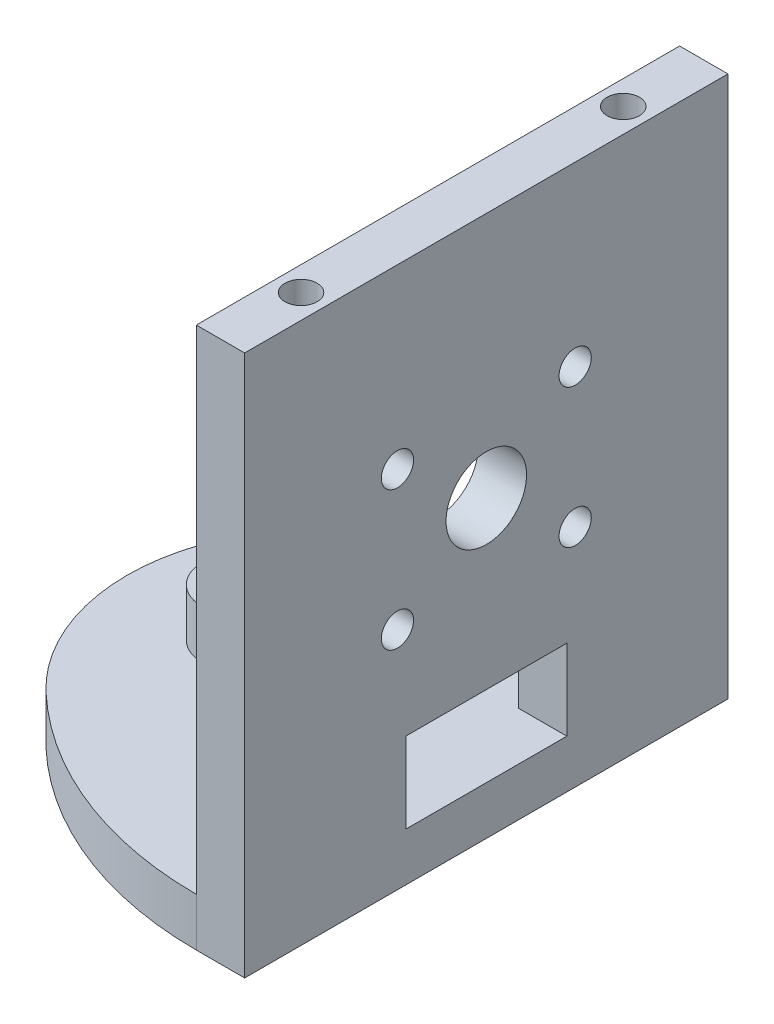
ISO-10303-21;
HEADER;
FILE_DESCRIPTION(('STEP AP214'),'2;1');
FILE_NAME('part.step','',(''),(''),'','','');
FILE_SCHEMA(('AUTOMOTIVE_DESIGN { 1 0 10303 214 1 1 1 1 }'));
ENDSEC;
DATA;
#1=APPLICATION_CONTEXT('core data for automotive mechanical design processes');
#2=APPLICATION_PROTOCOL_DEFINITION('international standard','automotive_design',2000,#1);
#3=PRODUCT_CONTEXT('',#1,'mechanical');
#4=PRODUCT('Part','Part','',(#3));
#5=PRODUCT_RELATED_PRODUCT_CATEGORY('part','',(#4));
#6=PRODUCT_DEFINITION_FORMATION('','',#4);
#7=PRODUCT_DEFINITION_CONTEXT('part definition',#1,'design');
#8=PRODUCT_DEFINITION('design','',#6,#7);
#9=PRODUCT_DEFINITION_SHAPE('','',#8);
#10=(LENGTH_UNIT() NAMED_UNIT(*) SI_UNIT(.MILLI.,.METRE.));
#11=(NAMED_UNIT(*) PLANE_ANGLE_UNIT() SI_UNIT($,.RADIAN.));
#12=(NAMED_UNIT(*) SI_UNIT($,.STERADIAN.) SOLID_ANGLE_UNIT());
#13=UNCERTAINTY_MEASURE_WITH_UNIT(LENGTH_MEASURE(1.E-05),#10,'distance_accuracy_value','');
#14=(GEOMETRIC_REPRESENTATION_CONTEXT(3) GLOBAL_UNCERTAINTY_ASSIGNED_CONTEXT((#13)) GLOBAL_UNIT_ASSIGNED_CONTEXT((#10,
#11,#12)) REPRESENTATION_CONTEXT('',''));
#15=CARTESIAN_POINT('',(0.,0.,0.));
#16=DIRECTION('',(0.,0.,1.));
#17=DIRECTION('',(1.,0.,0.));
#18=AXIS2_PLACEMENT_3D('',#15,#16,#17);
#19=CARTESIAN_POINT('',(0.,0.,0.));
#20=DIRECTION('',(0.,1.,0.));
#21=DIRECTION('',(0.,0.,1.));
#22=AXIS2_PLACEMENT_3D('',#19,#20,#21);
#23=PLANE('',#22);
#24=DIRECTION('',(0.,0.,1.));
#25=VECTOR('',#24,1.);
#26=CARTESIAN_POINT('',(12.3,0.,-15.));
#27=LINE('',#26,#25);
#28=CARTESIAN_POINT('',(12.3,0.,-15.));
#29=VERTEX_POINT('',#28);
#30=CARTESIAN_POINT('',(12.3,0.,-5.));
#31=VERTEX_POINT('',#30);
#32=EDGE_CURVE('E197',#29,#31,#27,.T.);
#33=ORIENTED_EDGE('',*,*,#32,.F.);
#34=CARTESIAN_POINT('',(12.3,0.,7.54962402661894));
#35=DIRECTION('',(0.,1.,0.));
#36=DIRECTION('',(0.,0.,1.));
#37=AXIS2_PLACEMENT_3D('',#34,#35,#36);
#38=CIRCLE('',#37,22.5496240266189);
#39=CARTESIAN_POINT('',(-3.2,0.,-8.8282739991312));
#40=VERTEX_POINT('',#39);
#41=EDGE_CURVE('E211',#29,#40,#38,.T.);
#42=ORIENTED_EDGE('',*,*,#41,.T.);
#43=CARTESIAN_POINT('',(5.15505550049156,0.,0.));
#44=DIRECTION('',(0.,1.,0.));
#45=DIRECTION('',(0.,0.,1.));
#46=AXIS2_PLACEMENT_3D('',#43,#44,#45);
#47=CIRCLE('',#46,12.1550555004916);
#48=CARTESIAN_POINT('',(-3.2,0.,8.8282739991312));
#49=VERTEX_POINT('',#48);
#50=EDGE_CURVE('E231',#40,#49,#47,.T.);
#51=ORIENTED_EDGE('',*,*,#50,.T.);
#52=CARTESIAN_POINT('',(12.3,0.,-7.54962402661894));
#53=DIRECTION('',(0.,1.,0.));
#54=DIRECTION('',(0.,0.,1.));
#55=AXIS2_PLACEMENT_3D('',#52,#53,#54);
#56=CIRCLE('',#55,22.5496240266189);
#57=CARTESIAN_POINT('',(12.3,0.,15.));
#58=VERTEX_POINT('',#57);
#59=EDGE_CURVE('E216',#58,#49,#56,.F.);
#60=ORIENTED_EDGE('',*,*,#59,.F.);
#61=CARTESIAN_POINT('',(12.3,0.,5.));
#62=VERTEX_POINT('',#61);
#63=EDGE_CURVE('E190',#62,#58,#27,.T.);
#64=ORIENTED_EDGE('',*,*,#63,.F.);
#65=DIRECTION('',(-1.,0.,0.));
#66=VECTOR('',#65,1.);
#67=CARTESIAN_POINT('',(15.3,0.,5.));
#68=LINE('',#67,#66);
#69=CARTESIAN_POINT('',(15.3,0.,5.));
#70=VERTEX_POINT('',#69);
#71=EDGE_CURVE('E125',#70,#62,#68,.T.);
#72=ORIENTED_EDGE('',*,*,#71,.F.);
#73=DIRECTION('',(0.,0.,1.));
#74=VECTOR('',#73,1.);
#75=CARTESIAN_POINT('',(15.3,0.,-5.));
#76=LINE('',#75,#74);
#77=CARTESIAN_POINT('',(15.3,0.,-5.));
#78=VERTEX_POINT('',#77);
#79=EDGE_CURVE('E129',#78,#70,#76,.T.);
#80=ORIENTED_EDGE('',*,*,#79,.F.);
#81=DIRECTION('',(-1.,0.,0.));
#82=VECTOR('',#81,1.);
#83=CARTESIAN_POINT('',(15.3,0.,-5.));
#84=LINE('',#83,#82);
#85=EDGE_CURVE('E117',#78,#31,#84,.T.);
#86=ORIENTED_EDGE('',*,*,#85,.T.);
#87=EDGE_LOOP('',(#33,#42,#51,#60,#64,#72,#80,#86));
#88=FACE_BOUND('',#87,.T.);
#89=CARTESIAN_POINT('',(0.,0.,0.));
#90=DIRECTION('',(0.,1.,0.));
#91=DIRECTION('',(0.,0.,1.));
#92=AXIS2_PLACEMENT_3D('',#89,#90,#91);
#93=CIRCLE('',#92,2.35);
#94=CARTESIAN_POINT('',(0.,0.,2.35));
#95=VERTEX_POINT('',#94);
#96=EDGE_CURVE('E171',#95,#95,#93,.T.);
#97=ORIENTED_EDGE('',*,*,#96,.F.);
#98=EDGE_LOOP('',(#97));
#99=FACE_BOUND('',#98,.T.);
#100=ADVANCED_FACE('F34',(#88,#99),#23,.T.);
#101=CARTESIAN_POINT('',(12.3,-3.,7.54962402661894));
#102=DIRECTION('',(0.,1.,0.));
#103=DIRECTION('',(0.,0.,1.));
#104=AXIS2_PLACEMENT_3D('',#101,#102,#103);
#105=CYLINDRICAL_SURFACE('',#104,22.5496240266189);
#106=ORIENTED_EDGE('',*,*,#41,.F.);
#107=DIRECTION('',(0.,1.,0.));
#108=VECTOR('',#107,1.);
#109=CARTESIAN_POINT('',(12.3,-3.,-15.));
#110=LINE('',#109,#108);
#111=CARTESIAN_POINT('',(12.3,-3.,-15.));
#112=VERTEX_POINT('',#111);
#113=EDGE_CURVE('E11',#112,#29,#110,.T.);
#114=ORIENTED_EDGE('',*,*,#113,.F.);
#115=CARTESIAN_POINT('',(12.3,-3.,7.54962402661894));
#116=DIRECTION('',(0.,1.,0.));
#117=DIRECTION('',(0.,0.,1.));
#118=AXIS2_PLACEMENT_3D('',#115,#116,#117);
#119=CIRCLE('',#118,22.5496240266189);
#120=CARTESIAN_POINT('',(-3.2,-3.,-8.8282739991312));
#121=VERTEX_POINT('',#120);
#122=EDGE_CURVE('E212',#112,#121,#119,.T.);
#123=ORIENTED_EDGE('',*,*,#122,.T.);
#124=DIRECTION('',(0.,1.,0.));
#125=VECTOR('',#124,1.);
#126=CARTESIAN_POINT('',(-3.2,-3.,-8.8282739991312));
#127=LINE('',#126,#125);
#128=EDGE_CURVE('E228',#121,#40,#127,.T.);
#129=ORIENTED_EDGE('',*,*,#128,.T.);
#130=EDGE_LOOP('',(#106,#114,#123,#129));
#131=FACE_BOUND('',#130,.T.);
#132=ADVANCED_FACE('F36',(#131),#105,.T.);
#133=CARTESIAN_POINT('',(0.,-3.,-15.));
#134=DIRECTION('',(0.,0.,1.));
#135=DIRECTION('',(1.,0.,0.));
#136=AXIS2_PLACEMENT_3D('',#133,#134,#135);
#137=PLANE('',#136);
#138=ORIENTED_EDGE('',*,*,#113,.T.);
#139=DIRECTION('',(0.,-1.,0.));
#140=VECTOR('',#139,1.);
#141=CARTESIAN_POINT('',(12.3,30.6,-15.));
#142=LINE('',#141,#140);
#143=CARTESIAN_POINT('',(12.3,30.6,-15.));
#144=VERTEX_POINT('',#143);
#145=EDGE_CURVE('E208',#144,#29,#142,.T.);
#146=ORIENTED_EDGE('',*,*,#145,.F.);
#147=DIRECTION('',(-1.,0.,0.));
#148=VECTOR('',#147,1.);
#149=CARTESIAN_POINT('',(15.3,30.6,-15.));
#150=LINE('',#149,#148);
#151=CARTESIAN_POINT('',(15.3,30.6,-15.));
#152=VERTEX_POINT('',#151);
#153=EDGE_CURVE('E196',#152,#144,#150,.T.);
#154=ORIENTED_EDGE('',*,*,#153,.F.);
#155=DIRECTION('',(0.,1.,0.));
#156=VECTOR('',#155,1.);
#157=CARTESIAN_POINT('',(15.3,-3.,-15.));
#158=LINE('',#157,#156);
#159=CARTESIAN_POINT('',(15.3,-3.,-15.));
#160=VERTEX_POINT('',#159);
#161=EDGE_CURVE('E43',#160,#152,#158,.T.);
#162=ORIENTED_EDGE('',*,*,#161,.F.);
#163=DIRECTION('',(1.,0.,0.));
#164=VECTOR('',#163,1.);
#165=CARTESIAN_POINT('',(0.,-3.,-15.));
#166=LINE('',#165,#164);
#167=EDGE_CURVE('E226',#112,#160,#166,.T.);
#168=ORIENTED_EDGE('',*,*,#167,.F.);
#169=EDGE_LOOP('',(#138,#146,#154,#162,#168));
#170=FACE_BOUND('',#169,.T.);
#171=ADVANCED_FACE('F275',(#170),#137,.F.);
#172=CARTESIAN_POINT('',(15.3,-3.,0.));
#173=DIRECTION('',(-1.,0.,0.));
#174=DIRECTION('',(0.,0.,1.));
#175=AXIS2_PLACEMENT_3D('',#172,#173,#174);
#176=PLANE('',#175);
#177=DIRECTION('',(0.,0.,-1.));
#178=VECTOR('',#177,1.);
#179=CARTESIAN_POINT('',(15.3,5.,-5.));
#180=LINE('',#179,#178);
#181=CARTESIAN_POINT('',(15.3,5.,5.));
#182=VERTEX_POINT('',#181);
#183=CARTESIAN_POINT('',(15.3,5.,-5.));
#184=VERTEX_POINT('',#183);
#185=EDGE_CURVE('E126',#182,#184,#180,.T.);
#186=ORIENTED_EDGE('',*,*,#185,.T.);
#187=DIRECTION('',(0.,-1.,0.));
#188=VECTOR('',#187,1.);
#189=CARTESIAN_POINT('',(15.3,0.,-5.));
#190=LINE('',#189,#188);
#191=EDGE_CURVE('E121',#184,#78,#190,.T.);
#192=ORIENTED_EDGE('',*,*,#191,.T.);
#193=ORIENTED_EDGE('',*,*,#79,.T.);
#194=DIRECTION('',(0.,1.,0.));
#195=VECTOR('',#194,1.);
#196=CARTESIAN_POINT('',(15.3,0.,5.));
#197=LINE('',#196,#195);
#198=EDGE_CURVE('E51',#70,#182,#197,.T.);
#199=ORIENTED_EDGE('',*,*,#198,.T.);
#200=EDGE_LOOP('',(#186,#192,#193,#199));
#201=FACE_BOUND('',#200,.T.);
#202=CARTESIAN_POINT('',(15.3,10.9909182971804,5.51650386371886));
#203=DIRECTION('',(1.,0.,0.));
#204=DIRECTION('',(0.,0.,-1.));
#205=AXIS2_PLACEMENT_3D('',#202,#203,#204);
#206=CIRCLE('',#205,0.999999999999998);
#207=CARTESIAN_POINT('',(15.3,10.9909182971804,4.51650386371887));
#208=VERTEX_POINT('',#207);
#209=EDGE_CURVE('E150',#208,#208,#206,.T.);
#210=ORIENTED_EDGE('',*,*,#209,.F.);
#211=EDGE_LOOP('',(#210));
#212=FACE_BOUND('',#211,.T.);
#213=CARTESIAN_POINT('',(15.3,19.6101789091115,5.51564663221372));
#214=DIRECTION('',(1.,0.,0.));
#215=DIRECTION('',(0.,0.,-1.));
#216=AXIS2_PLACEMENT_3D('',#213,#214,#215);
#217=CIRCLE('',#216,1.);
#218=CARTESIAN_POINT('',(15.3,19.6101789091115,4.51564663221372));
#219=VERTEX_POINT('',#218);
#220=EDGE_CURVE('E156',#219,#219,#217,.T.);
#221=ORIENTED_EDGE('',*,*,#220,.F.);
#222=EDGE_LOOP('',(#221));
#223=FACE_BOUND('',#222,.T.);
#224=CARTESIAN_POINT('',(15.3,10.9898210908885,-5.51564663221372));
#225=DIRECTION('',(1.,0.,0.));
#226=DIRECTION('',(0.,0.,-1.));
#227=AXIS2_PLACEMENT_3D('',#224,#225,#226);
#228=CIRCLE('',#227,0.999999999999998);
#229=CARTESIAN_POINT('',(15.3,10.9898210908885,-6.51564663221372));
#230=VERTEX_POINT('',#229);
#231=EDGE_CURVE('E160',#230,#230,#228,.T.);
#232=ORIENTED_EDGE('',*,*,#231,.F.);
#233=EDGE_LOOP('',(#232));
#234=FACE_BOUND('',#233,.T.);
#235=CARTESIAN_POINT('',(15.3,19.6090817028196,-5.51650386371886));
#236=DIRECTION('',(1.,0.,0.));
#237=DIRECTION('',(0.,0.,-1.));
#238=AXIS2_PLACEMENT_3D('',#235,#236,#237);
#239=CIRCLE('',#238,1.);
#240=CARTESIAN_POINT('',(15.3,19.6090817028196,-6.51650386371886));
#241=VERTEX_POINT('',#240);
#242=EDGE_CURVE('E164',#241,#241,#239,.T.);
#243=ORIENTED_EDGE('',*,*,#242,.F.);
#244=EDGE_LOOP('',(#243));
#245=FACE_BOUND('',#244,.T.);
#246=CARTESIAN_POINT('',(15.3,15.3,0.));
#247=DIRECTION('',(-1.,0.,0.));
#248=DIRECTION('',(0.,0.,1.));
#249=AXIS2_PLACEMENT_3D('',#246,#247,#248);
#250=CIRCLE('',#249,2.5);
#251=CARTESIAN_POINT('',(15.3,15.3,2.5));
#252=VERTEX_POINT('',#251);
#253=EDGE_CURVE('E168',#252,#252,#250,.T.);
#254=ORIENTED_EDGE('',*,*,#253,.T.);
#255=EDGE_LOOP('',(#254));
#256=FACE_BOUND('',#255,.T.);
#257=ORIENTED_EDGE('',*,*,#161,.T.);
#258=DIRECTION('',(0.,0.,-1.));
#259=VECTOR('',#258,1.);
#260=CARTESIAN_POINT('',(15.3,30.6,-15.));
#261=LINE('',#260,#259);
#262=CARTESIAN_POINT('',(15.3,30.6,15.));
#263=VERTEX_POINT('',#262);
#264=EDGE_CURVE('E193',#263,#152,#261,.T.);
#265=ORIENTED_EDGE('',*,*,#264,.F.);
#266=DIRECTION('',(0.,1.,0.));
#267=VECTOR('',#266,1.);
#268=CARTESIAN_POINT('',(15.3,-3.,15.));
#269=LINE('',#268,#267);
#270=CARTESIAN_POINT('',(15.3,-3.,15.));
#271=VERTEX_POINT('',#270);
#272=EDGE_CURVE('E237',#271,#263,#269,.T.);
#273=ORIENTED_EDGE('',*,*,#272,.F.);
#274=DIRECTION('',(0.,0.,1.));
#275=VECTOR('',#274,1.);
#276=CARTESIAN_POINT('',(15.3,-3.,0.));
#277=LINE('',#276,#275);
#278=EDGE_CURVE('E224',#160,#271,#277,.T.);
#279=ORIENTED_EDGE('',*,*,#278,.F.);
#280=EDGE_LOOP('',(#257,#265,#273,#279));
#281=FACE_BOUND('',#280,.T.);
#282=ADVANCED_FACE('F134',(#201,#212,#223,#234,#245,#256,#281),#176,.F.);
#283=CARTESIAN_POINT('',(0.,-3.,15.));
#284=DIRECTION('',(0.,0.,1.));
#285=DIRECTION('',(1.,0.,0.));
#286=AXIS2_PLACEMENT_3D('',#283,#284,#285);
#287=PLANE('',#286);
#288=ORIENTED_EDGE('',*,*,#272,.T.);
#289=DIRECTION('',(1.,0.,0.));
#290=VECTOR('',#289,1.);
#291=CARTESIAN_POINT('',(15.3,30.6,15.));
#292=LINE('',#291,#290);
#293=CARTESIAN_POINT('',(12.3,30.6,15.));
#294=VERTEX_POINT('',#293);
#295=EDGE_CURVE('E201',#294,#263,#292,.T.);
#296=ORIENTED_EDGE('',*,*,#295,.F.);
#297=DIRECTION('',(0.,-1.,0.));
#298=VECTOR('',#297,1.);
#299=CARTESIAN_POINT('',(12.3,30.6,15.));
#300=LINE('',#299,#298);
#301=EDGE_CURVE('E204',#294,#58,#300,.T.);
#302=ORIENTED_EDGE('',*,*,#301,.T.);
#303=DIRECTION('',(0.,1.,0.));
#304=VECTOR('',#303,1.);
#305=CARTESIAN_POINT('',(12.3,-3.,15.));
#306=LINE('',#305,#304);
#307=CARTESIAN_POINT('',(12.3,-3.,15.));
#308=VERTEX_POINT('',#307);
#309=EDGE_CURVE('E239',#308,#58,#306,.T.);
#310=ORIENTED_EDGE('',*,*,#309,.F.);
#311=DIRECTION('',(1.,0.,0.));
#312=VECTOR('',#311,1.);
#313=CARTESIAN_POINT('',(0.,-3.,15.));
#314=LINE('',#313,#312);
#315=EDGE_CURVE('E221',#308,#271,#314,.T.);
#316=ORIENTED_EDGE('',*,*,#315,.T.);
#317=EDGE_LOOP('',(#288,#296,#302,#310,#316));
#318=FACE_BOUND('',#317,.T.);
#319=ADVANCED_FACE('F286',(#318),#287,.T.);
#320=CARTESIAN_POINT('',(12.3,-3.,-7.54962402661894));
#321=DIRECTION('',(0.,1.,0.));
#322=DIRECTION('',(0.,0.,1.));
#323=AXIS2_PLACEMENT_3D('',#320,#321,#322);
#324=CYLINDRICAL_SURFACE('',#323,22.5496240266189);
#325=ORIENTED_EDGE('',*,*,#59,.T.);
#326=DIRECTION('',(0.,1.,0.));
#327=VECTOR('',#326,1.);
#328=CARTESIAN_POINT('',(-3.2,-3.,8.8282739991312));
#329=LINE('',#328,#327);
#330=CARTESIAN_POINT('',(-3.2,-3.,8.8282739991312));
#331=VERTEX_POINT('',#330);
#332=EDGE_CURVE('E242',#331,#49,#329,.T.);
#333=ORIENTED_EDGE('',*,*,#332,.F.);
#334=CARTESIAN_POINT('',(12.3,-3.,-7.54962402661894));
#335=DIRECTION('',(0.,1.,0.));
#336=DIRECTION('',(0.,0.,1.));
#337=AXIS2_PLACEMENT_3D('',#334,#335,#336);
#338=CIRCLE('',#337,22.5496240266189);
#339=EDGE_CURVE('E219',#308,#331,#338,.F.);
#340=ORIENTED_EDGE('',*,*,#339,.F.);
#341=ORIENTED_EDGE('',*,*,#309,.T.);
#342=EDGE_LOOP('',(#325,#333,#340,#341));
#343=FACE_BOUND('',#342,.T.);
#344=ADVANCED_FACE('F289',(#343),#324,.T.);
#345=CARTESIAN_POINT('',(5.15505550049156,-3.,0.));
#346=DIRECTION('',(0.,1.,0.));
#347=DIRECTION('',(0.,0.,1.));
#348=AXIS2_PLACEMENT_3D('',#345,#346,#347);
#349=CYLINDRICAL_SURFACE('',#348,12.1550555004916);
#350=ORIENTED_EDGE('',*,*,#50,.F.);
#351=ORIENTED_EDGE('',*,*,#128,.F.);
#352=CARTESIAN_POINT('',(5.15505550049156,-3.,0.));
#353=DIRECTION('',(0.,1.,0.));
#354=DIRECTION('',(0.,0.,1.));
#355=AXIS2_PLACEMENT_3D('',#352,#353,#354);
#356=CIRCLE('',#355,12.1550555004916);
#357=EDGE_CURVE('E215',#121,#331,#356,.T.);
#358=ORIENTED_EDGE('',*,*,#357,.T.);
#359=ORIENTED_EDGE('',*,*,#332,.T.);
#360=EDGE_LOOP('',(#350,#351,#358,#359));
#361=FACE_BOUND('',#360,.T.);
#362=ADVANCED_FACE('F292',(#361),#349,.T.);
#363=CARTESIAN_POINT('',(0.,-3.,0.));
#364=DIRECTION('',(0.,1.,0.));
#365=DIRECTION('',(0.,0.,1.));
#366=AXIS2_PLACEMENT_3D('',#363,#364,#365);
#367=PLANE('',#366);
#368=ORIENTED_EDGE('',*,*,#122,.F.);
#369=ORIENTED_EDGE('',*,*,#167,.T.);
#370=ORIENTED_EDGE('',*,*,#278,.T.);
#371=ORIENTED_EDGE('',*,*,#315,.F.);
#372=ORIENTED_EDGE('',*,*,#339,.T.);
#373=ORIENTED_EDGE('',*,*,#357,.F.);
#374=EDGE_LOOP('',(#368,#369,#370,#371,#372,#373));
#375=FACE_BOUND('',#374,.T.);
#376=ADVANCED_FACE('F279',(#375),#367,.F.);
#377=CARTESIAN_POINT('',(12.3,30.6,-15.));
#378=DIRECTION('',(1.,0.,0.));
#379=DIRECTION('',(0.,0.,-1.));
#380=AXIS2_PLACEMENT_3D('',#377,#378,#379);
#381=PLANE('',#380);
#382=CARTESIAN_POINT('',(12.3,10.9909182971804,5.51650386371886));
#383=DIRECTION('',(1.,0.,0.));
#384=DIRECTION('',(0.,0.,-1.));
#385=AXIS2_PLACEMENT_3D('',#382,#383,#384);
#386=CIRCLE('',#385,0.999999999999998);
#387=CARTESIAN_POINT('',(12.3,10.9909182971804,4.51650386371887));
#388=VERTEX_POINT('',#387);
#389=EDGE_CURVE('E38',#388,#388,#386,.T.);
#390=ORIENTED_EDGE('',*,*,#389,.T.);
#391=EDGE_LOOP('',(#390));
#392=FACE_BOUND('',#391,.T.);
#393=CARTESIAN_POINT('',(12.3,19.6101789091115,5.51564663221372));
#394=DIRECTION('',(1.,0.,0.));
#395=DIRECTION('',(0.,0.,-1.));
#396=AXIS2_PLACEMENT_3D('',#393,#394,#395);
#397=CIRCLE('',#396,1.);
#398=CARTESIAN_POINT('',(12.3,19.6101789091115,4.51564663221372));
#399=VERTEX_POINT('',#398);
#400=EDGE_CURVE('E159',#399,#399,#397,.T.);
#401=ORIENTED_EDGE('',*,*,#400,.T.);
#402=EDGE_LOOP('',(#401));
#403=FACE_BOUND('',#402,.T.);
#404=CARTESIAN_POINT('',(12.3,10.9898210908885,-5.51564663221372));
#405=DIRECTION('',(1.,0.,0.));
#406=DIRECTION('',(0.,0.,-1.));
#407=AXIS2_PLACEMENT_3D('',#404,#405,#406);
#408=CIRCLE('',#407,0.999999999999998);
#409=CARTESIAN_POINT('',(12.3,10.9898210908885,-6.51564663221372));
#410=VERTEX_POINT('',#409);
#411=EDGE_CURVE('E163',#410,#410,#408,.T.);
#412=ORIENTED_EDGE('',*,*,#411,.T.);
#413=EDGE_LOOP('',(#412));
#414=FACE_BOUND('',#413,.T.);
#415=CARTESIAN_POINT('',(12.3,19.6090817028196,-5.51650386371886));
#416=DIRECTION('',(1.,0.,0.));
#417=DIRECTION('',(0.,0.,-1.));
#418=AXIS2_PLACEMENT_3D('',#415,#416,#417);
#419=CIRCLE('',#418,1.);
#420=CARTESIAN_POINT('',(12.3,19.6090817028196,-6.51650386371886));
#421=VERTEX_POINT('',#420);
#422=EDGE_CURVE('E167',#421,#421,#419,.T.);
#423=ORIENTED_EDGE('',*,*,#422,.T.);
#424=EDGE_LOOP('',(#423));
#425=FACE_BOUND('',#424,.T.);
#426=CARTESIAN_POINT('',(12.3,15.3,0.));
#427=DIRECTION('',(-1.,0.,0.));
#428=DIRECTION('',(0.,0.,1.));
#429=AXIS2_PLACEMENT_3D('',#426,#427,#428);
#430=CIRCLE('',#429,2.5);
#431=CARTESIAN_POINT('',(12.3,15.3,2.5));
#432=VERTEX_POINT('',#431);
#433=EDGE_CURVE('E172',#432,#432,#430,.T.);
#434=ORIENTED_EDGE('',*,*,#433,.F.);
#435=EDGE_LOOP('',(#434));
#436=FACE_BOUND('',#435,.T.);
#437=ORIENTED_EDGE('',*,*,#32,.T.);
#438=DIRECTION('',(0.,-1.,0.));
#439=VECTOR('',#438,1.);
#440=CARTESIAN_POINT('',(12.3,0.,-5.));
#441=LINE('',#440,#439);
#442=CARTESIAN_POINT('',(12.3,5.,-5.));
#443=VERTEX_POINT('',#442);
#444=EDGE_CURVE('E59',#443,#31,#441,.T.);
#445=ORIENTED_EDGE('',*,*,#444,.F.);
#446=DIRECTION('',(0.,0.,-1.));
#447=VECTOR('',#446,1.);
#448=CARTESIAN_POINT('',(12.3,5.,-5.));
#449=LINE('',#448,#447);
#450=CARTESIAN_POINT('',(12.3,5.,5.));
#451=VERTEX_POINT('',#450);
#452=EDGE_CURVE('E137',#451,#443,#449,.T.);
#453=ORIENTED_EDGE('',*,*,#452,.F.);
#454=DIRECTION('',(0.,1.,0.));
#455=VECTOR('',#454,1.);
#456=CARTESIAN_POINT('',(12.3,0.,5.));
#457=LINE('',#456,#455);
#458=EDGE_CURVE('E140',#62,#451,#457,.T.);
#459=ORIENTED_EDGE('',*,*,#458,.F.);
#460=ORIENTED_EDGE('',*,*,#63,.T.);
#461=ORIENTED_EDGE('',*,*,#301,.F.);
#462=DIRECTION('',(0.,0.,1.));
#463=VECTOR('',#462,1.);
#464=CARTESIAN_POINT('',(12.3,30.6,-15.));
#465=LINE('',#464,#463);
#466=EDGE_CURVE('E199',#144,#294,#465,.T.);
#467=ORIENTED_EDGE('',*,*,#466,.F.);
#468=ORIENTED_EDGE('',*,*,#145,.T.);
#469=EDGE_LOOP('',(#437,#445,#453,#459,#460,#461,#467,#468));
#470=FACE_BOUND('',#469,.T.);
#471=ADVANCED_FACE('F251',(#392,#403,#414,#425,#436,#470),#381,.F.);
#472=CARTESIAN_POINT('',(0.,30.6,0.));
#473=DIRECTION('',(0.,-1.,0.));
#474=DIRECTION('',(0.,0.,-1.));
#475=AXIS2_PLACEMENT_3D('',#472,#473,#474);
#476=PLANE('',#475);
#477=CARTESIAN_POINT('',(13.8,30.6,10.));
#478=DIRECTION('',(0.,1.,0.));
#479=DIRECTION('',(0.,0.,1.));
#480=AXIS2_PLACEMENT_3D('',#477,#478,#479);
#481=CIRCLE('',#480,1.);
#482=CARTESIAN_POINT('',(13.8,30.6,11.));
#483=VERTEX_POINT('',#482);
#484=EDGE_CURVE('E178',#483,#483,#481,.T.);
#485=ORIENTED_EDGE('',*,*,#484,.F.);
#486=EDGE_LOOP('',(#485));
#487=FACE_BOUND('',#486,.T.);
#488=CARTESIAN_POINT('',(13.8,30.6,-10.));
#489=DIRECTION('',(0.,1.,0.));
#490=DIRECTION('',(0.,0.,1.));
#491=AXIS2_PLACEMENT_3D('',#488,#489,#490);
#492=CIRCLE('',#491,1.);
#493=CARTESIAN_POINT('',(13.8,30.6,-9.));
#494=VERTEX_POINT('',#493);
#495=EDGE_CURVE('E184',#494,#494,#492,.T.);
#496=ORIENTED_EDGE('',*,*,#495,.F.);
#497=EDGE_LOOP('',(#496));
#498=FACE_BOUND('',#497,.T.);
#499=ORIENTED_EDGE('',*,*,#264,.T.);
#500=ORIENTED_EDGE('',*,*,#153,.T.);
#501=ORIENTED_EDGE('',*,*,#466,.T.);
#502=ORIENTED_EDGE('',*,*,#295,.T.);
#503=EDGE_LOOP('',(#499,#500,#501,#502));
#504=FACE_BOUND('',#503,.T.);
#505=ADVANCED_FACE('F349',(#487,#498,#504),#476,.F.);
#506=CARTESIAN_POINT('',(13.8,27.6,-10.));
#507=DIRECTION('',(0.,1.,0.));
#508=DIRECTION('',(0.,0.,1.));
#509=AXIS2_PLACEMENT_3D('',#506,#507,#508);
#510=CYLINDRICAL_SURFACE('',#509,1.);
#511=CARTESIAN_POINT('',(13.8,27.6,-10.));
#512=DIRECTION('',(0.,1.,0.));
#513=DIRECTION('',(0.,0.,1.));
#514=AXIS2_PLACEMENT_3D('',#511,#512,#513);
#515=CIRCLE('',#514,1.);
#516=CARTESIAN_POINT('',(13.8,27.6,-9.));
#517=VERTEX_POINT('',#516);
#518=EDGE_CURVE('E187',#517,#517,#515,.T.);
#519=ORIENTED_EDGE('',*,*,#518,.F.);
#520=EDGE_LOOP('',(#519));
#521=FACE_BOUND('',#520,.T.);
#522=ORIENTED_EDGE('',*,*,#495,.T.);
#523=EDGE_LOOP('',(#522));
#524=FACE_BOUND('',#523,.T.);
#525=ADVANCED_FACE('F444',(#521,#524),#510,.F.);
#526=CARTESIAN_POINT('',(13.8,27.6,-10.));
#527=DIRECTION('',(0.,1.,0.));
#528=DIRECTION('',(0.,0.,1.));
#529=AXIS2_PLACEMENT_3D('',#526,#527,#528);
#530=PLANE('',#529);
#531=ORIENTED_EDGE('',*,*,#518,.T.);
#532=EDGE_LOOP('',(#531));
#533=FACE_BOUND('',#532,.T.);
#534=ADVANCED_FACE('F434',(#533),#530,.T.);
#535=CARTESIAN_POINT('',(13.8,27.6,10.));
#536=DIRECTION('',(0.,1.,0.));
#537=DIRECTION('',(0.,0.,1.));
#538=AXIS2_PLACEMENT_3D('',#535,#536,#537);
#539=CYLINDRICAL_SURFACE('',#538,1.);
#540=CARTESIAN_POINT('',(13.8,27.6,10.));
#541=DIRECTION('',(0.,1.,0.));
#542=DIRECTION('',(0.,0.,1.));
#543=AXIS2_PLACEMENT_3D('',#540,#541,#542);
#544=CIRCLE('',#543,1.);
#545=CARTESIAN_POINT('',(13.8,27.6,11.));
#546=VERTEX_POINT('',#545);
#547=EDGE_CURVE('E181',#546,#546,#544,.T.);
#548=ORIENTED_EDGE('',*,*,#547,.F.);
#549=EDGE_LOOP('',(#548));
#550=FACE_BOUND('',#549,.T.);
#551=ORIENTED_EDGE('',*,*,#484,.T.);
#552=EDGE_LOOP('',(#551));
#553=FACE_BOUND('',#552,.T.);
#554=ADVANCED_FACE('F423',(#550,#553),#539,.F.);
#555=CARTESIAN_POINT('',(13.8,27.6,10.));
#556=DIRECTION('',(0.,1.,0.));
#557=DIRECTION('',(0.,0.,1.));
#558=AXIS2_PLACEMENT_3D('',#555,#556,#557);
#559=PLANE('',#558);
#560=ORIENTED_EDGE('',*,*,#547,.T.);
#561=EDGE_LOOP('',(#560));
#562=FACE_BOUND('',#561,.T.);
#563=ADVANCED_FACE('F413',(#562),#559,.T.);
#564=CARTESIAN_POINT('',(0.,3.,0.));
#565=DIRECTION('',(0.,-1.,0.));
#566=DIRECTION('',(0.,0.,-1.));
#567=AXIS2_PLACEMENT_3D('',#564,#565,#566);
#568=CYLINDRICAL_SURFACE('',#567,2.35);
#569=CARTESIAN_POINT('',(0.,3.,0.));
#570=DIRECTION('',(0.,1.,0.));
#571=DIRECTION('',(0.,0.,1.));
#572=AXIS2_PLACEMENT_3D('',#569,#570,#571);
#573=CIRCLE('',#572,2.35);
#574=CARTESIAN_POINT('',(0.,3.,2.35));
#575=VERTEX_POINT('',#574);
#576=EDGE_CURVE('E175',#575,#575,#573,.T.);
#577=ORIENTED_EDGE('',*,*,#576,.F.);
#578=EDGE_LOOP('',(#577));
#579=FACE_BOUND('',#578,.T.);
#580=ORIENTED_EDGE('',*,*,#96,.T.);
#581=EDGE_LOOP('',(#580));
#582=FACE_BOUND('',#581,.T.);
#583=ADVANCED_FACE('F403',(#579,#582),#568,.T.);
#584=CARTESIAN_POINT('',(0.,3.,0.));
#585=DIRECTION('',(0.,1.,0.));
#586=DIRECTION('',(0.,0.,1.));
#587=AXIS2_PLACEMENT_3D('',#584,#585,#586);
#588=PLANE('',#587);
#589=ORIENTED_EDGE('',*,*,#576,.T.);
#590=EDGE_LOOP('',(#589));
#591=FACE_BOUND('',#590,.T.);
#592=ADVANCED_FACE('F393',(#591),#588,.T.);
#593=CARTESIAN_POINT('',(15.3,15.3,0.));
#594=DIRECTION('',(-1.,0.,0.));
#595=DIRECTION('',(0.,0.,1.));
#596=AXIS2_PLACEMENT_3D('',#593,#594,#595);
#597=CYLINDRICAL_SURFACE('',#596,2.5);
#598=ORIENTED_EDGE('',*,*,#253,.F.);
#599=EDGE_LOOP('',(#598));
#600=FACE_BOUND('',#599,.T.);
#601=ORIENTED_EDGE('',*,*,#433,.T.);
#602=EDGE_LOOP('',(#601));
#603=FACE_BOUND('',#602,.T.);
#604=ADVANCED_FACE('F383',(#600,#603),#597,.F.);
#605=CARTESIAN_POINT('',(5.3,19.6090817028196,-5.51650386371886));
#606=DIRECTION('',(1.,0.,0.));
#607=DIRECTION('',(0.,0.,-1.));
#608=AXIS2_PLACEMENT_3D('',#605,#606,#607);
#609=CYLINDRICAL_SURFACE('',#608,1.);
#610=ORIENTED_EDGE('',*,*,#242,.T.);
#611=EDGE_LOOP('',(#610));
#612=FACE_BOUND('',#611,.T.);
#613=ORIENTED_EDGE('',*,*,#422,.F.);
#614=EDGE_LOOP('',(#613));
#615=FACE_BOUND('',#614,.T.);
#616=ADVANCED_FACE('F266',(#612,#615),#609,.F.);
#617=CARTESIAN_POINT('',(5.3,10.9898210908885,-5.51564663221372));
#618=DIRECTION('',(1.,0.,0.));
#619=DIRECTION('',(0.,0.,-1.));
#620=AXIS2_PLACEMENT_3D('',#617,#618,#619);
#621=CYLINDRICAL_SURFACE('',#620,0.999999999999998);
#622=ORIENTED_EDGE('',*,*,#231,.T.);
#623=EDGE_LOOP('',(#622));
#624=FACE_BOUND('',#623,.T.);
#625=ORIENTED_EDGE('',*,*,#411,.F.);
#626=EDGE_LOOP('',(#625));
#627=FACE_BOUND('',#626,.T.);
#628=ADVANCED_FACE('F257',(#624,#627),#621,.F.);
#629=CARTESIAN_POINT('',(5.3,19.6101789091115,5.51564663221372));
#630=DIRECTION('',(1.,0.,0.));
#631=DIRECTION('',(0.,0.,-1.));
#632=AXIS2_PLACEMENT_3D('',#629,#630,#631);
#633=CYLINDRICAL_SURFACE('',#632,1.);
#634=ORIENTED_EDGE('',*,*,#220,.T.);
#635=EDGE_LOOP('',(#634));
#636=FACE_BOUND('',#635,.T.);
#637=ORIENTED_EDGE('',*,*,#400,.F.);
#638=EDGE_LOOP('',(#637));
#639=FACE_BOUND('',#638,.T.);
#640=ADVANCED_FACE('F254',(#636,#639),#633,.F.);
#641=CARTESIAN_POINT('',(5.3,10.9909182971804,5.51650386371886));
#642=DIRECTION('',(1.,0.,0.));
#643=DIRECTION('',(0.,0.,-1.));
#644=AXIS2_PLACEMENT_3D('',#641,#642,#643);
#645=CYLINDRICAL_SURFACE('',#644,0.999999999999998);
#646=ORIENTED_EDGE('',*,*,#209,.T.);
#647=EDGE_LOOP('',(#646));
#648=FACE_BOUND('',#647,.T.);
#649=ORIENTED_EDGE('',*,*,#389,.F.);
#650=EDGE_LOOP('',(#649));
#651=FACE_BOUND('',#650,.T.);
#652=ADVANCED_FACE('F256',(#648,#651),#645,.F.);
#653=CARTESIAN_POINT('',(15.3,0.,-5.));
#654=DIRECTION('',(0.,0.,-1.));
#655=DIRECTION('',(-1.,0.,0.));
#656=AXIS2_PLACEMENT_3D('',#653,#654,#655);
#657=PLANE('',#656);
#658=ORIENTED_EDGE('',*,*,#444,.T.);
#659=ORIENTED_EDGE('',*,*,#85,.F.);
#660=ORIENTED_EDGE('',*,*,#191,.F.);
#661=DIRECTION('',(-1.,0.,0.));
#662=VECTOR('',#661,1.);
#663=CARTESIAN_POINT('',(15.3,5.,-5.));
#664=LINE('',#663,#662);
#665=EDGE_CURVE('E148',#184,#443,#664,.T.);
#666=ORIENTED_EDGE('',*,*,#665,.T.);
#667=EDGE_LOOP('',(#658,#659,#660,#666));
#668=FACE_BOUND('',#667,.T.);
#669=ADVANCED_FACE('F119',(#668),#657,.F.);
#670=CARTESIAN_POINT('',(15.3,5.,-5.));
#671=DIRECTION('',(0.,1.,0.));
#672=DIRECTION('',(0.,0.,1.));
#673=AXIS2_PLACEMENT_3D('',#670,#671,#672);
#674=PLANE('',#673);
#675=ORIENTED_EDGE('',*,*,#452,.T.);
#676=ORIENTED_EDGE('',*,*,#665,.F.);
#677=ORIENTED_EDGE('',*,*,#185,.F.);
#678=DIRECTION('',(-1.,0.,0.));
#679=VECTOR('',#678,1.);
#680=CARTESIAN_POINT('',(15.3,5.,5.));
#681=LINE('',#680,#679);
#682=EDGE_CURVE('E151',#182,#451,#681,.T.);
#683=ORIENTED_EDGE('',*,*,#682,.T.);
#684=EDGE_LOOP('',(#675,#676,#677,#683));
#685=FACE_BOUND('',#684,.T.);
#686=ADVANCED_FACE('F321',(#685),#674,.F.);
#687=CARTESIAN_POINT('',(15.3,0.,5.));
#688=DIRECTION('',(0.,0.,1.));
#689=DIRECTION('',(0.,-1.,0.));
#690=AXIS2_PLACEMENT_3D('',#687,#688,#689);
#691=PLANE('',#690);
#692=ORIENTED_EDGE('',*,*,#458,.T.);
#693=ORIENTED_EDGE('',*,*,#682,.F.);
#694=ORIENTED_EDGE('',*,*,#198,.F.);
#695=ORIENTED_EDGE('',*,*,#71,.T.);
#696=EDGE_LOOP('',(#692,#693,#694,#695));
#697=FACE_BOUND('',#696,.T.);
#698=ADVANCED_FACE('F319',(#697),#691,.F.);
#699=CLOSED_SHELL('',(#100,#132,#171,#282,#319,#344,#362,#376,#471,#505,#525,#534,#554,#563,
#583,#592,#604,#616,#628,#640,#652,#669,#686,#698));
#700=MANIFOLD_SOLID_BREP('B2',#699);
#701=ADVANCED_BREP_SHAPE_REPRESENTATION('',(#18,#700),#14);
#702=SHAPE_DEFINITION_REPRESENTATION(#9,#701);
ENDSEC;
END-ISO-10303-21;
